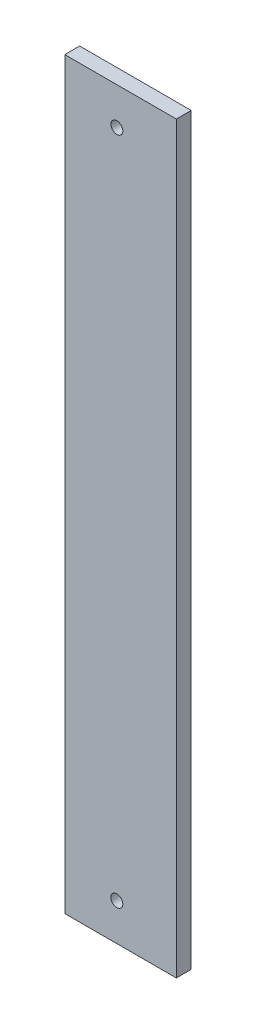
ISO-10303-21;
HEADER;
FILE_DESCRIPTION(('STEP AP214'),'2;1');
FILE_NAME('part.step','',(''),(''),'','','');
FILE_SCHEMA(('AUTOMOTIVE_DESIGN { 1 0 10303 214 1 1 1 1 }'));
ENDSEC;
DATA;
#1=APPLICATION_CONTEXT('core data for automotive mechanical design processes');
#2=APPLICATION_PROTOCOL_DEFINITION('international standard','automotive_design',2000,#1);
#3=PRODUCT_CONTEXT('',#1,'mechanical');
#4=PRODUCT('Part','Part','',(#3));
#5=PRODUCT_RELATED_PRODUCT_CATEGORY('part','',(#4));
#6=PRODUCT_DEFINITION_FORMATION('','',#4);
#7=PRODUCT_DEFINITION_CONTEXT('part definition',#1,'design');
#8=PRODUCT_DEFINITION('design','',#6,#7);
#9=PRODUCT_DEFINITION_SHAPE('','',#8);
#10=(LENGTH_UNIT() NAMED_UNIT(*) SI_UNIT(.MILLI.,.METRE.));
#11=(NAMED_UNIT(*) PLANE_ANGLE_UNIT() SI_UNIT($,.RADIAN.));
#12=(NAMED_UNIT(*) SI_UNIT($,.STERADIAN.) SOLID_ANGLE_UNIT());
#13=UNCERTAINTY_MEASURE_WITH_UNIT(LENGTH_MEASURE(1.E-05),#10,'distance_accuracy_value','');
#14=(GEOMETRIC_REPRESENTATION_CONTEXT(3) GLOBAL_UNCERTAINTY_ASSIGNED_CONTEXT((#13)) GLOBAL_UNIT_ASSIGNED_CONTEXT((#10,
#11,#12)) REPRESENTATION_CONTEXT('',''));
#15=CARTESIAN_POINT('',(0.,0.,0.));
#16=DIRECTION('',(0.,0.,1.));
#17=DIRECTION('',(1.,0.,0.));
#18=AXIS2_PLACEMENT_3D('',#15,#16,#17);
#19=CARTESIAN_POINT('',(0.,500.,10.));
#20=DIRECTION('',(1.,0.,0.));
#21=DIRECTION('',(0.,0.,-1.));
#22=AXIS2_PLACEMENT_3D('',#19,#20,#21);
#23=PLANE('',#22);
#24=DIRECTION('',(0.,-1.,0.));
#25=VECTOR('',#24,1.);
#26=CARTESIAN_POINT('',(0.,500.,0.));
#27=LINE('',#26,#25);
#28=CARTESIAN_POINT('',(0.,500.,0.));
#29=VERTEX_POINT('',#28);
#30=CARTESIAN_POINT('',(0.,0.,0.));
#31=VERTEX_POINT('',#30);
#32=EDGE_CURVE('E111',#29,#31,#27,.T.);
#33=ORIENTED_EDGE('',*,*,#32,.T.);
#34=DIRECTION('',(0.,0.,-1.));
#35=VECTOR('',#34,1.);
#36=CARTESIAN_POINT('',(0.,0.,10.));
#37=LINE('',#36,#35);
#38=CARTESIAN_POINT('',(0.,0.,10.));
#39=VERTEX_POINT('',#38);
#40=EDGE_CURVE('E11',#39,#31,#37,.T.);
#41=ORIENTED_EDGE('',*,*,#40,.F.);
#42=DIRECTION('',(0.,-1.,0.));
#43=VECTOR('',#42,1.);
#44=CARTESIAN_POINT('',(0.,500.,10.));
#45=LINE('',#44,#43);
#46=CARTESIAN_POINT('',(0.,500.,10.));
#47=VERTEX_POINT('',#46);
#48=EDGE_CURVE('E95',#47,#39,#45,.T.);
#49=ORIENTED_EDGE('',*,*,#48,.F.);
#50=DIRECTION('',(0.,0.,-1.));
#51=VECTOR('',#50,1.);
#52=CARTESIAN_POINT('',(0.,500.,10.));
#53=LINE('',#52,#51);
#54=EDGE_CURVE('E107',#47,#29,#53,.T.);
#55=ORIENTED_EDGE('',*,*,#54,.T.);
#56=EDGE_LOOP('',(#33,#41,#49,#55));
#57=FACE_BOUND('',#56,.T.);
#58=ADVANCED_FACE('F43',(#57),#23,.F.);
#59=CARTESIAN_POINT('',(0.,0.,10.));
#60=DIRECTION('',(0.,1.,0.));
#61=DIRECTION('',(0.,0.,1.));
#62=AXIS2_PLACEMENT_3D('',#59,#60,#61);
#63=PLANE('',#62);
#64=DIRECTION('',(1.,0.,0.));
#65=VECTOR('',#64,1.);
#66=CARTESIAN_POINT('',(0.,0.,0.));
#67=LINE('',#66,#65);
#68=CARTESIAN_POINT('',(75.,0.,0.));
#69=VERTEX_POINT('',#68);
#70=EDGE_CURVE('E100',#31,#69,#67,.T.);
#71=ORIENTED_EDGE('',*,*,#70,.T.);
#72=DIRECTION('',(0.,0.,-1.));
#73=VECTOR('',#72,1.);
#74=CARTESIAN_POINT('',(75.,0.,10.));
#75=LINE('',#74,#73);
#76=CARTESIAN_POINT('',(75.,0.,10.));
#77=VERTEX_POINT('',#76);
#78=EDGE_CURVE('E52',#77,#69,#75,.T.);
#79=ORIENTED_EDGE('',*,*,#78,.F.);
#80=DIRECTION('',(1.,0.,0.));
#81=VECTOR('',#80,1.);
#82=CARTESIAN_POINT('',(0.,0.,10.));
#83=LINE('',#82,#81);
#84=EDGE_CURVE('E90',#39,#77,#83,.T.);
#85=ORIENTED_EDGE('',*,*,#84,.F.);
#86=ORIENTED_EDGE('',*,*,#40,.T.);
#87=EDGE_LOOP('',(#71,#79,#85,#86));
#88=FACE_BOUND('',#87,.T.);
#89=ADVANCED_FACE('F99',(#88),#63,.F.);
#90=CARTESIAN_POINT('',(75.,0.,10.));
#91=DIRECTION('',(-1.,0.,0.));
#92=DIRECTION('',(0.,0.,1.));
#93=AXIS2_PLACEMENT_3D('',#90,#91,#92);
#94=PLANE('',#93);
#95=DIRECTION('',(0.,1.,0.));
#96=VECTOR('',#95,1.);
#97=CARTESIAN_POINT('',(75.,0.,0.));
#98=LINE('',#97,#96);
#99=CARTESIAN_POINT('',(75.,500.,0.));
#100=VERTEX_POINT('',#99);
#101=EDGE_CURVE('E77',#69,#100,#98,.T.);
#102=ORIENTED_EDGE('',*,*,#101,.T.);
#103=DIRECTION('',(0.,0.,-1.));
#104=VECTOR('',#103,1.);
#105=CARTESIAN_POINT('',(75.,500.,10.));
#106=LINE('',#105,#104);
#107=CARTESIAN_POINT('',(75.,500.,10.));
#108=VERTEX_POINT('',#107);
#109=EDGE_CURVE('E102',#108,#100,#106,.T.);
#110=ORIENTED_EDGE('',*,*,#109,.F.);
#111=DIRECTION('',(0.,1.,0.));
#112=VECTOR('',#111,1.);
#113=CARTESIAN_POINT('',(75.,0.,10.));
#114=LINE('',#113,#112);
#115=EDGE_CURVE('E93',#77,#108,#114,.T.);
#116=ORIENTED_EDGE('',*,*,#115,.F.);
#117=ORIENTED_EDGE('',*,*,#78,.T.);
#118=EDGE_LOOP('',(#102,#110,#116,#117));
#119=FACE_BOUND('',#118,.T.);
#120=ADVANCED_FACE('F103',(#119),#94,.F.);
#121=CARTESIAN_POINT('',(75.,500.,10.));
#122=DIRECTION('',(0.,-1.,0.));
#123=DIRECTION('',(0.,0.,-1.));
#124=AXIS2_PLACEMENT_3D('',#121,#122,#123);
#125=PLANE('',#124);
#126=DIRECTION('',(-1.,0.,0.));
#127=VECTOR('',#126,1.);
#128=CARTESIAN_POINT('',(75.,500.,0.));
#129=LINE('',#128,#127);
#130=EDGE_CURVE('E83',#100,#29,#129,.T.);
#131=ORIENTED_EDGE('',*,*,#130,.T.);
#132=ORIENTED_EDGE('',*,*,#54,.F.);
#133=DIRECTION('',(-1.,0.,0.));
#134=VECTOR('',#133,1.);
#135=CARTESIAN_POINT('',(75.,500.,10.));
#136=LINE('',#135,#134);
#137=EDGE_CURVE('E60',#108,#47,#136,.T.);
#138=ORIENTED_EDGE('',*,*,#137,.F.);
#139=ORIENTED_EDGE('',*,*,#109,.T.);
#140=EDGE_LOOP('',(#131,#132,#138,#139));
#141=FACE_BOUND('',#140,.T.);
#142=ADVANCED_FACE('F125',(#141),#125,.F.);
#143=CARTESIAN_POINT('',(0.,0.,10.));
#144=DIRECTION('',(0.,0.,1.));
#145=DIRECTION('',(1.,0.,0.));
#146=AXIS2_PLACEMENT_3D('',#143,#144,#145);
#147=PLANE('',#146);
#148=CARTESIAN_POINT('',(35.,25.,10.));
#149=DIRECTION('',(0.,0.,1.));
#150=DIRECTION('',(1.,0.,0.));
#151=AXIS2_PLACEMENT_3D('',#148,#149,#150);
#152=CIRCLE('',#151,3.99999999999999);
#153=CARTESIAN_POINT('',(39.,25.,10.));
#154=VERTEX_POINT('',#153);
#155=EDGE_CURVE('E143',#154,#154,#152,.T.);
#156=ORIENTED_EDGE('',*,*,#155,.F.);
#157=EDGE_LOOP('',(#156));
#158=FACE_BOUND('',#157,.T.);
#159=CARTESIAN_POINT('',(35.,475.,10.));
#160=DIRECTION('',(0.,0.,1.));
#161=DIRECTION('',(1.,0.,0.));
#162=AXIS2_PLACEMENT_3D('',#159,#160,#161);
#163=CIRCLE('',#162,3.99999999999999);
#164=CARTESIAN_POINT('',(39.,475.,10.));
#165=VERTEX_POINT('',#164);
#166=EDGE_CURVE('E135',#165,#165,#163,.T.);
#167=ORIENTED_EDGE('',*,*,#166,.F.);
#168=EDGE_LOOP('',(#167));
#169=FACE_BOUND('',#168,.T.);
#170=ORIENTED_EDGE('',*,*,#48,.T.);
#171=ORIENTED_EDGE('',*,*,#84,.T.);
#172=ORIENTED_EDGE('',*,*,#115,.T.);
#173=ORIENTED_EDGE('',*,*,#137,.T.);
#174=EDGE_LOOP('',(#170,#171,#172,#173));
#175=FACE_BOUND('',#174,.T.);
#176=ADVANCED_FACE('F91',(#158,#169,#175),#147,.T.);
#177=CARTESIAN_POINT('',(0.,0.,0.));
#178=DIRECTION('',(0.,0.,1.));
#179=DIRECTION('',(1.,0.,0.));
#180=AXIS2_PLACEMENT_3D('',#177,#178,#179);
#181=PLANE('',#180);
#182=CARTESIAN_POINT('',(35.,25.,0.));
#183=DIRECTION('',(0.,0.,1.));
#184=DIRECTION('',(1.,0.,0.));
#185=AXIS2_PLACEMENT_3D('',#182,#183,#184);
#186=CIRCLE('',#185,4.);
#187=CARTESIAN_POINT('',(39.,25.,0.));
#188=VERTEX_POINT('',#187);
#189=EDGE_CURVE('E139',#188,#188,#186,.T.);
#190=ORIENTED_EDGE('',*,*,#189,.T.);
#191=EDGE_LOOP('',(#190));
#192=FACE_BOUND('',#191,.T.);
#193=CARTESIAN_POINT('',(35.,475.,0.));
#194=DIRECTION('',(0.,0.,1.));
#195=DIRECTION('',(1.,0.,0.));
#196=AXIS2_PLACEMENT_3D('',#193,#194,#195);
#197=CIRCLE('',#196,4.);
#198=CARTESIAN_POINT('',(39.,475.,0.));
#199=VERTEX_POINT('',#198);
#200=EDGE_CURVE('E115',#199,#199,#197,.T.);
#201=ORIENTED_EDGE('',*,*,#200,.T.);
#202=EDGE_LOOP('',(#201));
#203=FACE_BOUND('',#202,.T.);
#204=ORIENTED_EDGE('',*,*,#32,.F.);
#205=ORIENTED_EDGE('',*,*,#130,.F.);
#206=ORIENTED_EDGE('',*,*,#101,.F.);
#207=ORIENTED_EDGE('',*,*,#70,.F.);
#208=EDGE_LOOP('',(#204,#205,#206,#207));
#209=FACE_BOUND('',#208,.T.);
#210=ADVANCED_FACE('F128',(#192,#203,#209),#181,.F.);
#211=CARTESIAN_POINT('',(35.,475.,10.));
#212=DIRECTION('',(0.,0.,1.));
#213=DIRECTION('',(1.,0.,0.));
#214=AXIS2_PLACEMENT_3D('',#211,#212,#213);
#215=CYLINDRICAL_SURFACE('',#214,3.99999999999999);
#216=ORIENTED_EDGE('',*,*,#200,.F.);
#217=EDGE_LOOP('',(#216));
#218=FACE_BOUND('',#217,.T.);
#219=ORIENTED_EDGE('',*,*,#166,.T.);
#220=EDGE_LOOP('',(#219));
#221=FACE_BOUND('',#220,.T.);
#222=ADVANCED_FACE('F155',(#218,#221),#215,.F.);
#223=CARTESIAN_POINT('',(35.,25.,10.));
#224=DIRECTION('',(0.,0.,1.));
#225=DIRECTION('',(1.,0.,0.));
#226=AXIS2_PLACEMENT_3D('',#223,#224,#225);
#227=CYLINDRICAL_SURFACE('',#226,3.99999999999999);
#228=ORIENTED_EDGE('',*,*,#189,.F.);
#229=EDGE_LOOP('',(#228));
#230=FACE_BOUND('',#229,.T.);
#231=ORIENTED_EDGE('',*,*,#155,.T.);
#232=EDGE_LOOP('',(#231));
#233=FACE_BOUND('',#232,.T.);
#234=ADVANCED_FACE('F148',(#230,#233),#227,.F.);
#235=CLOSED_SHELL('',(#58,#89,#120,#142,#176,#210,#222,#234));
#236=MANIFOLD_SOLID_BREP('B2',#235);
#237=ADVANCED_BREP_SHAPE_REPRESENTATION('',(#18,#236),#14);
#238=SHAPE_DEFINITION_REPRESENTATION(#9,#237);
ENDSEC;
END-ISO-10303-21;
